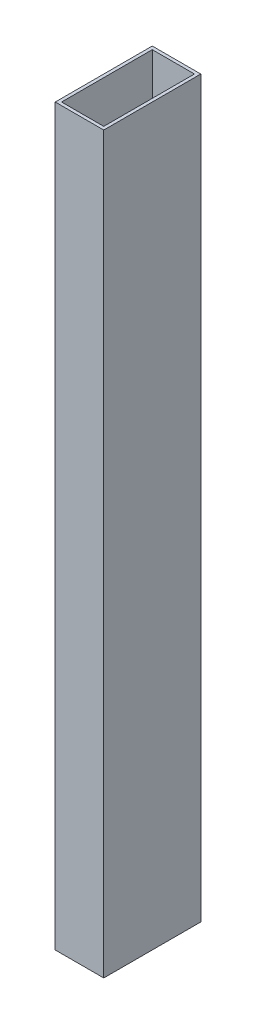
ISO-10303-21;
HEADER;
FILE_DESCRIPTION(('STEP AP214'),'2;1');
FILE_NAME('part.step','',(''),(''),'','','');
FILE_SCHEMA(('AUTOMOTIVE_DESIGN { 1 0 10303 214 1 1 1 1 }'));
ENDSEC;
DATA;
#1=APPLICATION_CONTEXT('core data for automotive mechanical design processes');
#2=APPLICATION_PROTOCOL_DEFINITION('international standard','automotive_design',2000,#1);
#3=PRODUCT_CONTEXT('',#1,'mechanical');
#4=PRODUCT('Part','Part','',(#3));
#5=PRODUCT_RELATED_PRODUCT_CATEGORY('part','',(#4));
#6=PRODUCT_DEFINITION_FORMATION('','',#4);
#7=PRODUCT_DEFINITION_CONTEXT('part definition',#1,'design');
#8=PRODUCT_DEFINITION('design','',#6,#7);
#9=PRODUCT_DEFINITION_SHAPE('','',#8);
#10=(LENGTH_UNIT() NAMED_UNIT(*) SI_UNIT(.MILLI.,.METRE.));
#11=(NAMED_UNIT(*) PLANE_ANGLE_UNIT() SI_UNIT($,.RADIAN.));
#12=(NAMED_UNIT(*) SI_UNIT($,.STERADIAN.) SOLID_ANGLE_UNIT());
#13=UNCERTAINTY_MEASURE_WITH_UNIT(LENGTH_MEASURE(1.E-05),#10,'distance_accuracy_value','');
#14=(GEOMETRIC_REPRESENTATION_CONTEXT(3) GLOBAL_UNCERTAINTY_ASSIGNED_CONTEXT((#13)) GLOBAL_UNIT_ASSIGNED_CONTEXT((#10,
#11,#12)) REPRESENTATION_CONTEXT('',''));
#15=CARTESIAN_POINT('',(0.,0.,0.));
#16=DIRECTION('',(0.,0.,1.));
#17=DIRECTION('',(1.,0.,0.));
#18=AXIS2_PLACEMENT_3D('',#15,#16,#17);
#19=CARTESIAN_POINT('',(12.7,384.556,-25.4));
#20=DIRECTION('',(-1.,0.,0.));
#21=DIRECTION('',(0.,0.,1.));
#22=AXIS2_PLACEMENT_3D('',#19,#20,#21);
#23=PLANE('',#22);
#24=DIRECTION('',(0.,0.,-1.));
#25=VECTOR('',#24,1.);
#26=CARTESIAN_POINT('',(12.7,0.,-25.4));
#27=LINE('',#26,#25);
#28=CARTESIAN_POINT('',(12.7,0.,25.4));
#29=VERTEX_POINT('',#28);
#30=CARTESIAN_POINT('',(12.7,0.,-25.4));
#31=VERTEX_POINT('',#30);
#32=EDGE_CURVE('E119',#29,#31,#27,.T.);
#33=ORIENTED_EDGE('',*,*,#32,.T.);
#34=DIRECTION('',(0.,-1.,0.));
#35=VECTOR('',#34,1.);
#36=CARTESIAN_POINT('',(12.7,384.556,-25.4));
#37=LINE('',#36,#35);
#38=CARTESIAN_POINT('',(12.7,384.556,-25.4));
#39=VERTEX_POINT('',#38);
#40=EDGE_CURVE('E150',#39,#31,#37,.T.);
#41=ORIENTED_EDGE('',*,*,#40,.F.);
#42=DIRECTION('',(0.,0.,-1.));
#43=VECTOR('',#42,1.);
#44=CARTESIAN_POINT('',(12.7,384.556,-25.4));
#45=LINE('',#44,#43);
#46=CARTESIAN_POINT('',(12.7,384.556,25.4));
#47=VERTEX_POINT('',#46);
#48=EDGE_CURVE('E124',#47,#39,#45,.T.);
#49=ORIENTED_EDGE('',*,*,#48,.F.);
#50=DIRECTION('',(0.,-1.,0.));
#51=VECTOR('',#50,1.);
#52=CARTESIAN_POINT('',(12.7,384.556,25.4));
#53=LINE('',#52,#51);
#54=EDGE_CURVE('E134',#47,#29,#53,.T.);
#55=ORIENTED_EDGE('',*,*,#54,.T.);
#56=EDGE_LOOP('',(#33,#41,#49,#55));
#57=FACE_BOUND('',#56,.T.);
#58=ADVANCED_FACE('F32',(#57),#23,.F.);
#59=CARTESIAN_POINT('',(-12.7,384.556,-25.4));
#60=DIRECTION('',(0.,0.,1.));
#61=DIRECTION('',(1.,0.,0.));
#62=AXIS2_PLACEMENT_3D('',#59,#60,#61);
#63=PLANE('',#62);
#64=DIRECTION('',(-1.,0.,0.));
#65=VECTOR('',#64,1.);
#66=CARTESIAN_POINT('',(-12.7,0.,-25.4));
#67=LINE('',#66,#65);
#68=CARTESIAN_POINT('',(-12.7,0.,-25.4));
#69=VERTEX_POINT('',#68);
#70=EDGE_CURVE('E137',#31,#69,#67,.T.);
#71=ORIENTED_EDGE('',*,*,#70,.T.);
#72=DIRECTION('',(0.,-1.,0.));
#73=VECTOR('',#72,1.);
#74=CARTESIAN_POINT('',(-12.7,384.556,-25.4));
#75=LINE('',#74,#73);
#76=CARTESIAN_POINT('',(-12.7,384.556,-25.4));
#77=VERTEX_POINT('',#76);
#78=EDGE_CURVE('E147',#77,#69,#75,.T.);
#79=ORIENTED_EDGE('',*,*,#78,.F.);
#80=DIRECTION('',(-1.,0.,0.));
#81=VECTOR('',#80,1.);
#82=CARTESIAN_POINT('',(-12.7,384.556,-25.4));
#83=LINE('',#82,#81);
#84=EDGE_CURVE('E127',#39,#77,#83,.T.);
#85=ORIENTED_EDGE('',*,*,#84,.F.);
#86=ORIENTED_EDGE('',*,*,#40,.T.);
#87=EDGE_LOOP('',(#71,#79,#85,#86));
#88=FACE_BOUND('',#87,.T.);
#89=ADVANCED_FACE('F173',(#88),#63,.F.);
#90=CARTESIAN_POINT('',(-12.7,384.556,-25.4));
#91=DIRECTION('',(1.,0.,0.));
#92=DIRECTION('',(0.,0.,-1.));
#93=AXIS2_PLACEMENT_3D('',#90,#91,#92);
#94=PLANE('',#93);
#95=DIRECTION('',(0.,0.,1.));
#96=VECTOR('',#95,1.);
#97=CARTESIAN_POINT('',(-12.7,0.,-25.4));
#98=LINE('',#97,#96);
#99=CARTESIAN_POINT('',(-12.7,0.,25.4));
#100=VERTEX_POINT('',#99);
#101=EDGE_CURVE('E139',#69,#100,#98,.T.);
#102=ORIENTED_EDGE('',*,*,#101,.T.);
#103=DIRECTION('',(0.,-1.,0.));
#104=VECTOR('',#103,1.);
#105=CARTESIAN_POINT('',(-12.7,384.556,25.4));
#106=LINE('',#105,#104);
#107=CARTESIAN_POINT('',(-12.7,384.556,25.4));
#108=VERTEX_POINT('',#107);
#109=EDGE_CURVE('E144',#108,#100,#106,.T.);
#110=ORIENTED_EDGE('',*,*,#109,.F.);
#111=DIRECTION('',(0.,0.,1.));
#112=VECTOR('',#111,1.);
#113=CARTESIAN_POINT('',(-12.7,384.556,-25.4));
#114=LINE('',#113,#112);
#115=EDGE_CURVE('E130',#77,#108,#114,.T.);
#116=ORIENTED_EDGE('',*,*,#115,.F.);
#117=ORIENTED_EDGE('',*,*,#78,.T.);
#118=EDGE_LOOP('',(#102,#110,#116,#117));
#119=FACE_BOUND('',#118,.T.);
#120=ADVANCED_FACE('F178',(#119),#94,.F.);
#121=CARTESIAN_POINT('',(-12.7,384.556,25.4));
#122=DIRECTION('',(0.,0.,-1.));
#123=DIRECTION('',(-1.,0.,0.));
#124=AXIS2_PLACEMENT_3D('',#121,#122,#123);
#125=PLANE('',#124);
#126=DIRECTION('',(1.,0.,0.));
#127=VECTOR('',#126,1.);
#128=CARTESIAN_POINT('',(-12.7,0.,25.4));
#129=LINE('',#128,#127);
#130=EDGE_CURVE('E128',#100,#29,#129,.T.);
#131=ORIENTED_EDGE('',*,*,#130,.T.);
#132=ORIENTED_EDGE('',*,*,#54,.F.);
#133=DIRECTION('',(1.,0.,0.));
#134=VECTOR('',#133,1.);
#135=CARTESIAN_POINT('',(-12.7,384.556,25.4));
#136=LINE('',#135,#134);
#137=EDGE_CURVE('E132',#108,#47,#136,.T.);
#138=ORIENTED_EDGE('',*,*,#137,.F.);
#139=ORIENTED_EDGE('',*,*,#109,.T.);
#140=EDGE_LOOP('',(#131,#132,#138,#139));
#141=FACE_BOUND('',#140,.T.);
#142=ADVANCED_FACE('F191',(#141),#125,.F.);
#143=CARTESIAN_POINT('',(0.,384.556,0.));
#144=DIRECTION('',(0.,1.,0.));
#145=DIRECTION('',(0.,0.,1.));
#146=AXIS2_PLACEMENT_3D('',#143,#144,#145);
#147=PLANE('',#146);
#148=DIRECTION('',(0.,0.,-1.));
#149=VECTOR('',#148,1.);
#150=CARTESIAN_POINT('',(-11.049,384.556,23.749));
#151=LINE('',#150,#149);
#152=CARTESIAN_POINT('',(-11.049,384.556,23.749));
#153=VERTEX_POINT('',#152);
#154=CARTESIAN_POINT('',(-11.049,384.556,-23.749));
#155=VERTEX_POINT('',#154);
#156=EDGE_CURVE('E99',#153,#155,#151,.T.);
#157=ORIENTED_EDGE('',*,*,#156,.T.);
#158=DIRECTION('',(1.,0.,0.));
#159=VECTOR('',#158,1.);
#160=CARTESIAN_POINT('',(11.049,384.556,-23.749));
#161=LINE('',#160,#159);
#162=CARTESIAN_POINT('',(11.049,384.556,-23.749));
#163=VERTEX_POINT('',#162);
#164=EDGE_CURVE('E106',#155,#163,#161,.T.);
#165=ORIENTED_EDGE('',*,*,#164,.T.);
#166=DIRECTION('',(0.,0.,1.));
#167=VECTOR('',#166,1.);
#168=CARTESIAN_POINT('',(11.049,384.556,23.749));
#169=LINE('',#168,#167);
#170=CARTESIAN_POINT('',(11.049,384.556,23.749));
#171=VERTEX_POINT('',#170);
#172=EDGE_CURVE('E46',#163,#171,#169,.T.);
#173=ORIENTED_EDGE('',*,*,#172,.T.);
#174=DIRECTION('',(-1.,0.,0.));
#175=VECTOR('',#174,1.);
#176=CARTESIAN_POINT('',(11.049,384.556,23.749));
#177=LINE('',#176,#175);
#178=EDGE_CURVE('E103',#171,#153,#177,.T.);
#179=ORIENTED_EDGE('',*,*,#178,.T.);
#180=EDGE_LOOP('',(#157,#165,#173,#179));
#181=FACE_BOUND('',#180,.T.);
#182=ORIENTED_EDGE('',*,*,#48,.T.);
#183=ORIENTED_EDGE('',*,*,#84,.T.);
#184=ORIENTED_EDGE('',*,*,#115,.T.);
#185=ORIENTED_EDGE('',*,*,#137,.T.);
#186=EDGE_LOOP('',(#182,#183,#184,#185));
#187=FACE_BOUND('',#186,.T.);
#188=ADVANCED_FACE('F110',(#181,#187),#147,.T.);
#189=CARTESIAN_POINT('',(0.,0.,0.));
#190=DIRECTION('',(0.,1.,0.));
#191=DIRECTION('',(0.,0.,1.));
#192=AXIS2_PLACEMENT_3D('',#189,#190,#191);
#193=PLANE('',#192);
#194=DIRECTION('',(-1.,0.,0.));
#195=VECTOR('',#194,1.);
#196=CARTESIAN_POINT('',(0.,0.,-23.749));
#197=LINE('',#196,#195);
#198=CARTESIAN_POINT('',(11.049,1.11022302462516E-13,-23.749));
#199=VERTEX_POINT('',#198);
#200=CARTESIAN_POINT('',(-11.049,0.,-23.749));
#201=VERTEX_POINT('',#200);
#202=EDGE_CURVE('E153',#199,#201,#197,.T.);
#203=ORIENTED_EDGE('',*,*,#202,.T.);
#204=DIRECTION('',(0.,0.,1.));
#205=VECTOR('',#204,1.);
#206=CARTESIAN_POINT('',(-11.049,0.,0.));
#207=LINE('',#206,#205);
#208=CARTESIAN_POINT('',(-11.049,1.11022302462516E-13,23.749));
#209=VERTEX_POINT('',#208);
#210=EDGE_CURVE('E11',#201,#209,#207,.T.);
#211=ORIENTED_EDGE('',*,*,#210,.T.);
#212=DIRECTION('',(1.,0.,0.));
#213=VECTOR('',#212,1.);
#214=CARTESIAN_POINT('',(0.,0.,23.749));
#215=LINE('',#214,#213);
#216=CARTESIAN_POINT('',(11.049,1.11022302462516E-13,23.749));
#217=VERTEX_POINT('',#216);
#218=EDGE_CURVE('E39',#209,#217,#215,.T.);
#219=ORIENTED_EDGE('',*,*,#218,.T.);
#220=DIRECTION('',(0.,0.,-1.));
#221=VECTOR('',#220,1.);
#222=CARTESIAN_POINT('',(11.049,0.,0.));
#223=LINE('',#222,#221);
#224=EDGE_CURVE('E155',#217,#199,#223,.T.);
#225=ORIENTED_EDGE('',*,*,#224,.T.);
#226=EDGE_LOOP('',(#203,#211,#219,#225));
#227=FACE_BOUND('',#226,.T.);
#228=ORIENTED_EDGE('',*,*,#32,.F.);
#229=ORIENTED_EDGE('',*,*,#130,.F.);
#230=ORIENTED_EDGE('',*,*,#101,.F.);
#231=ORIENTED_EDGE('',*,*,#70,.F.);
#232=EDGE_LOOP('',(#228,#229,#230,#231));
#233=FACE_BOUND('',#232,.T.);
#234=ADVANCED_FACE('F159',(#227,#233),#193,.F.);
#235=CARTESIAN_POINT('',(-11.049,384.556,23.749));
#236=DIRECTION('',(-1.,0.,0.));
#237=DIRECTION('',(0.,0.,1.));
#238=AXIS2_PLACEMENT_3D('',#235,#236,#237);
#239=PLANE('',#238);
#240=DIRECTION('',(0.,-1.,0.));
#241=VECTOR('',#240,1.);
#242=CARTESIAN_POINT('',(-11.049,384.556,-23.749));
#243=LINE('',#242,#241);
#244=EDGE_CURVE('E54',#155,#201,#243,.T.);
#245=ORIENTED_EDGE('',*,*,#244,.F.);
#246=ORIENTED_EDGE('',*,*,#156,.F.);
#247=DIRECTION('',(0.,-1.,0.));
#248=VECTOR('',#247,1.);
#249=CARTESIAN_POINT('',(-11.049,384.556,23.749));
#250=LINE('',#249,#248);
#251=EDGE_CURVE('E117',#153,#209,#250,.T.);
#252=ORIENTED_EDGE('',*,*,#251,.T.);
#253=ORIENTED_EDGE('',*,*,#210,.F.);
#254=EDGE_LOOP('',(#245,#246,#252,#253));
#255=FACE_BOUND('',#254,.T.);
#256=ADVANCED_FACE('F96',(#255),#239,.F.);
#257=CARTESIAN_POINT('',(11.049,384.556,23.749));
#258=DIRECTION('',(0.,0.,1.));
#259=DIRECTION('',(1.,0.,0.));
#260=AXIS2_PLACEMENT_3D('',#257,#258,#259);
#261=PLANE('',#260);
#262=ORIENTED_EDGE('',*,*,#251,.F.);
#263=ORIENTED_EDGE('',*,*,#178,.F.);
#264=DIRECTION('',(0.,-1.,0.));
#265=VECTOR('',#264,1.);
#266=CARTESIAN_POINT('',(11.049,384.556,23.749));
#267=LINE('',#266,#265);
#268=EDGE_CURVE('E120',#171,#217,#267,.T.);
#269=ORIENTED_EDGE('',*,*,#268,.T.);
#270=ORIENTED_EDGE('',*,*,#218,.F.);
#271=EDGE_LOOP('',(#262,#263,#269,#270));
#272=FACE_BOUND('',#271,.T.);
#273=ADVANCED_FACE('F162',(#272),#261,.F.);
#274=CARTESIAN_POINT('',(11.049,384.556,23.749));
#275=DIRECTION('',(1.,0.,0.));
#276=DIRECTION('',(0.,0.,-1.));
#277=AXIS2_PLACEMENT_3D('',#274,#275,#276);
#278=PLANE('',#277);
#279=ORIENTED_EDGE('',*,*,#268,.F.);
#280=ORIENTED_EDGE('',*,*,#172,.F.);
#281=DIRECTION('',(0.,-1.,0.));
#282=VECTOR('',#281,1.);
#283=CARTESIAN_POINT('',(11.049,384.556,-23.749));
#284=LINE('',#283,#282);
#285=EDGE_CURVE('E102',#163,#199,#284,.T.);
#286=ORIENTED_EDGE('',*,*,#285,.T.);
#287=ORIENTED_EDGE('',*,*,#224,.F.);
#288=EDGE_LOOP('',(#279,#280,#286,#287));
#289=FACE_BOUND('',#288,.T.);
#290=ADVANCED_FACE('F163',(#289),#278,.F.);
#291=CARTESIAN_POINT('',(11.049,384.556,-23.749));
#292=DIRECTION('',(0.,0.,-1.));
#293=DIRECTION('',(-1.,0.,0.));
#294=AXIS2_PLACEMENT_3D('',#291,#292,#293);
#295=PLANE('',#294);
#296=ORIENTED_EDGE('',*,*,#285,.F.);
#297=ORIENTED_EDGE('',*,*,#164,.F.);
#298=ORIENTED_EDGE('',*,*,#244,.T.);
#299=ORIENTED_EDGE('',*,*,#202,.F.);
#300=EDGE_LOOP('',(#296,#297,#298,#299));
#301=FACE_BOUND('',#300,.T.);
#302=ADVANCED_FACE('F107',(#301),#295,.F.);
#303=CLOSED_SHELL('',(#58,#89,#120,#142,#188,#234,#256,#273,#290,#302));
#304=MANIFOLD_SOLID_BREP('B2',#303);
#305=ADVANCED_BREP_SHAPE_REPRESENTATION('',(#18,#304),#14);
#306=SHAPE_DEFINITION_REPRESENTATION(#9,#305);
ENDSEC;
END-ISO-10303-21;
